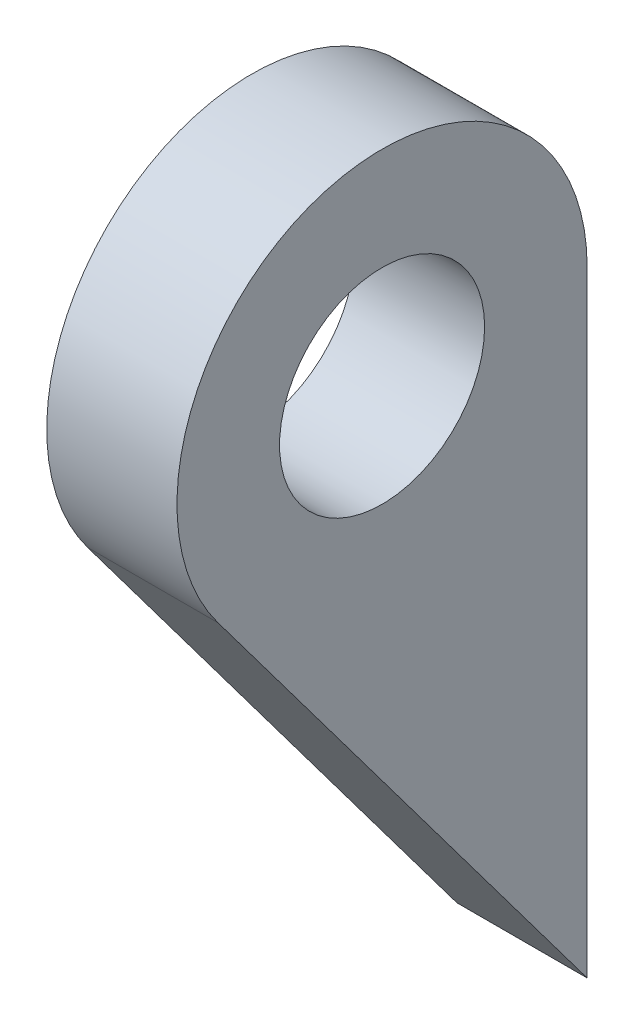
ISO-10303-21;
HEADER;
FILE_DESCRIPTION(('STEP AP214'),'2;1');
FILE_NAME('part.step','',(''),(''),'','','');
FILE_SCHEMA(('AUTOMOTIVE_DESIGN { 1 0 10303 214 1 1 1 1 }'));
ENDSEC;
DATA;
#1=APPLICATION_CONTEXT('core data for automotive mechanical design processes');
#2=APPLICATION_PROTOCOL_DEFINITION('international standard','automotive_design',2000,#1);
#3=PRODUCT_CONTEXT('',#1,'mechanical');
#4=PRODUCT('Part','Part','',(#3));
#5=PRODUCT_RELATED_PRODUCT_CATEGORY('part','',(#4));
#6=PRODUCT_DEFINITION_FORMATION('','',#4);
#7=PRODUCT_DEFINITION_CONTEXT('part definition',#1,'design');
#8=PRODUCT_DEFINITION('design','',#6,#7);
#9=PRODUCT_DEFINITION_SHAPE('','',#8);
#10=(LENGTH_UNIT() NAMED_UNIT(*) SI_UNIT(.MILLI.,.METRE.));
#11=(NAMED_UNIT(*) PLANE_ANGLE_UNIT() SI_UNIT($,.RADIAN.));
#12=(NAMED_UNIT(*) SI_UNIT($,.STERADIAN.) SOLID_ANGLE_UNIT());
#13=UNCERTAINTY_MEASURE_WITH_UNIT(LENGTH_MEASURE(1.E-05),#10,'distance_accuracy_value','');
#14=(GEOMETRIC_REPRESENTATION_CONTEXT(3) GLOBAL_UNCERTAINTY_ASSIGNED_CONTEXT((#13)) GLOBAL_UNIT_ASSIGNED_CONTEXT((#10,
#11,#12)) REPRESENTATION_CONTEXT('',''));
#15=CARTESIAN_POINT('',(0.,0.,0.));
#16=DIRECTION('',(0.,0.,1.));
#17=DIRECTION('',(1.,0.,0.));
#18=AXIS2_PLACEMENT_3D('',#15,#16,#17);
#19=CARTESIAN_POINT('',(-1.5875,0.,0.00226087849737773));
#20=DIRECTION('',(0.,0.,-1.));
#21=DIRECTION('',(-1.,0.,0.));
#22=AXIS2_PLACEMENT_3D('',#19,#20,#21);
#23=PLANE('',#22);
#24=DIRECTION('',(0.,1.,0.));
#25=VECTOR('',#24,1.);
#26=CARTESIAN_POINT('',(1.5875,0.,0.00226087849737773));
#27=LINE('',#26,#25);
#28=CARTESIAN_POINT('',(1.5875,-10.,0.00226087849737773));
#29=VERTEX_POINT('',#28);
#30=CARTESIAN_POINT('',(1.5875,5.,0.00226087849737816));
#31=VERTEX_POINT('',#30);
#32=EDGE_CURVE('E92',#29,#31,#27,.T.);
#33=ORIENTED_EDGE('',*,*,#32,.F.);
#34=DIRECTION('',(1.,0.,0.));
#35=VECTOR('',#34,1.);
#36=CARTESIAN_POINT('',(-1.5875,-10.,0.00226087849737773));
#37=LINE('',#36,#35);
#38=CARTESIAN_POINT('',(-1.5875,-10.,0.00226087849737773));
#39=VERTEX_POINT('',#38);
#40=EDGE_CURVE('E11',#39,#29,#37,.T.);
#41=ORIENTED_EDGE('',*,*,#40,.F.);
#42=DIRECTION('',(0.,1.,0.));
#43=VECTOR('',#42,1.);
#44=CARTESIAN_POINT('',(-1.5875,0.,0.00226087849737773));
#45=LINE('',#44,#43);
#46=CARTESIAN_POINT('',(-1.5875,5.,0.00226087849737816));
#47=VERTEX_POINT('',#46);
#48=EDGE_CURVE('E80',#39,#47,#45,.T.);
#49=ORIENTED_EDGE('',*,*,#48,.T.);
#50=DIRECTION('',(1.,0.,0.));
#51=VECTOR('',#50,1.);
#52=CARTESIAN_POINT('',(-1.5875,5.,0.00226087849737816));
#53=LINE('',#52,#51);
#54=EDGE_CURVE('E38',#47,#31,#53,.T.);
#55=ORIENTED_EDGE('',*,*,#54,.T.);
#56=EDGE_LOOP('',(#33,#41,#49,#55));
#57=FACE_BOUND('',#56,.T.);
#58=ADVANCED_FACE('F35',(#57),#23,.T.);
#59=CARTESIAN_POINT('',(-1.5875,-3.60108522167874,4.80144696223832));
#60=DIRECTION('',(0.,-0.6,0.8));
#61=DIRECTION('',(0.,-0.8,-0.6));
#62=AXIS2_PLACEMENT_3D('',#59,#60,#61);
#63=PLANE('',#62);
#64=DIRECTION('',(0.,-0.8,-0.6));
#65=VECTOR('',#64,1.);
#66=CARTESIAN_POINT('',(1.5875,-3.60108522167874,4.80144696223832));
#67=LINE('',#66,#65);
#68=CARTESIAN_POINT('',(1.5875,2.,9.00226087849738));
#69=VERTEX_POINT('',#68);
#70=EDGE_CURVE('E86',#69,#29,#67,.T.);
#71=ORIENTED_EDGE('',*,*,#70,.F.);
#72=DIRECTION('',(1.,0.,0.));
#73=VECTOR('',#72,1.);
#74=CARTESIAN_POINT('',(-1.5875,2.,9.00226087849738));
#75=LINE('',#74,#73);
#76=CARTESIAN_POINT('',(-1.5875,2.,9.00226087849738));
#77=VERTEX_POINT('',#76);
#78=EDGE_CURVE('E44',#77,#69,#75,.T.);
#79=ORIENTED_EDGE('',*,*,#78,.F.);
#80=DIRECTION('',(0.,-0.8,-0.6));
#81=VECTOR('',#80,1.);
#82=CARTESIAN_POINT('',(-1.5875,-3.60108522167874,4.80144696223832));
#83=LINE('',#82,#81);
#84=EDGE_CURVE('E81',#77,#39,#83,.T.);
#85=ORIENTED_EDGE('',*,*,#84,.T.);
#86=ORIENTED_EDGE('',*,*,#40,.T.);
#87=EDGE_LOOP('',(#71,#79,#85,#86));
#88=FACE_BOUND('',#87,.T.);
#89=ADVANCED_FACE('F99',(#88),#63,.T.);
#90=CARTESIAN_POINT('',(-1.5875,5.,5.00226087849738));
#91=DIRECTION('',(1.,0.,0.));
#92=DIRECTION('',(0.,0.,-1.));
#93=AXIS2_PLACEMENT_3D('',#90,#91,#92);
#94=CYLINDRICAL_SURFACE('',#93,5.);
#95=CARTESIAN_POINT('',(1.5875,5.,5.00226087849738));
#96=DIRECTION('',(1.,0.,0.));
#97=DIRECTION('',(0.,0.,-1.));
#98=AXIS2_PLACEMENT_3D('',#95,#96,#97);
#99=CIRCLE('',#98,5.);
#100=EDGE_CURVE('E74',#31,#69,#99,.T.);
#101=ORIENTED_EDGE('',*,*,#100,.F.);
#102=ORIENTED_EDGE('',*,*,#54,.F.);
#103=CARTESIAN_POINT('',(-1.5875,5.,5.00226087849738));
#104=DIRECTION('',(1.,0.,0.));
#105=DIRECTION('',(0.,0.,-1.));
#106=AXIS2_PLACEMENT_3D('',#103,#104,#105);
#107=CIRCLE('',#106,5.);
#108=EDGE_CURVE('E72',#47,#77,#107,.T.);
#109=ORIENTED_EDGE('',*,*,#108,.T.);
#110=ORIENTED_EDGE('',*,*,#78,.T.);
#111=EDGE_LOOP('',(#101,#102,#109,#110));
#112=FACE_BOUND('',#111,.T.);
#113=ADVANCED_FACE('F71',(#112),#94,.T.);
#114=CARTESIAN_POINT('',(-1.5875,5.,5.00226087849738));
#115=DIRECTION('',(1.,0.,0.));
#116=DIRECTION('',(0.,0.,-1.));
#117=AXIS2_PLACEMENT_3D('',#114,#115,#116);
#118=CYLINDRICAL_SURFACE('',#117,2.5);
#119=CARTESIAN_POINT('',(-1.5875,5.,5.00226087849738));
#120=DIRECTION('',(1.,0.,0.));
#121=DIRECTION('',(0.,0.,-1.));
#122=AXIS2_PLACEMENT_3D('',#119,#120,#121);
#123=CIRCLE('',#122,2.5);
#124=CARTESIAN_POINT('',(-1.5875,5.,2.50226087849738));
#125=VERTEX_POINT('',#124);
#126=EDGE_CURVE('E76',#125,#125,#123,.T.);
#127=ORIENTED_EDGE('',*,*,#126,.F.);
#128=EDGE_LOOP('',(#127));
#129=FACE_BOUND('',#128,.T.);
#130=CARTESIAN_POINT('',(1.5875,5.,5.00226087849738));
#131=DIRECTION('',(1.,0.,0.));
#132=DIRECTION('',(0.,0.,-1.));
#133=AXIS2_PLACEMENT_3D('',#130,#131,#132);
#134=CIRCLE('',#133,2.5);
#135=CARTESIAN_POINT('',(1.5875,5.,2.50226087849738));
#136=VERTEX_POINT('',#135);
#137=EDGE_CURVE('E83',#136,#136,#134,.T.);
#138=ORIENTED_EDGE('',*,*,#137,.T.);
#139=EDGE_LOOP('',(#138));
#140=FACE_BOUND('',#139,.T.);
#141=ADVANCED_FACE('F106',(#129,#140),#118,.F.);
#142=CARTESIAN_POINT('',(-1.5875,0.,0.));
#143=DIRECTION('',(1.,0.,0.));
#144=DIRECTION('',(0.,0.,-1.));
#145=AXIS2_PLACEMENT_3D('',#142,#143,#144);
#146=PLANE('',#145);
#147=ORIENTED_EDGE('',*,*,#48,.F.);
#148=ORIENTED_EDGE('',*,*,#84,.F.);
#149=ORIENTED_EDGE('',*,*,#108,.F.);
#150=EDGE_LOOP('',(#147,#148,#149));
#151=FACE_BOUND('',#150,.T.);
#152=ORIENTED_EDGE('',*,*,#126,.T.);
#153=EDGE_LOOP('',(#152));
#154=FACE_BOUND('',#153,.T.);
#155=ADVANCED_FACE('F78',(#151,#154),#146,.F.);
#156=CARTESIAN_POINT('',(1.5875,0.,0.));
#157=DIRECTION('',(1.,0.,0.));
#158=DIRECTION('',(0.,0.,-1.));
#159=AXIS2_PLACEMENT_3D('',#156,#157,#158);
#160=PLANE('',#159);
#161=ORIENTED_EDGE('',*,*,#32,.T.);
#162=ORIENTED_EDGE('',*,*,#100,.T.);
#163=ORIENTED_EDGE('',*,*,#70,.T.);
#164=EDGE_LOOP('',(#161,#162,#163));
#165=FACE_BOUND('',#164,.T.);
#166=ORIENTED_EDGE('',*,*,#137,.F.);
#167=EDGE_LOOP('',(#166));
#168=FACE_BOUND('',#167,.T.);
#169=ADVANCED_FACE('F97',(#165,#168),#160,.T.);
#170=CLOSED_SHELL('',(#58,#89,#113,#141,#155,#169));
#171=MANIFOLD_SOLID_BREP('B2',#170);
#172=ADVANCED_BREP_SHAPE_REPRESENTATION('',(#18,#171),#14);
#173=SHAPE_DEFINITION_REPRESENTATION(#9,#172);
ENDSEC;
END-ISO-10303-21;
